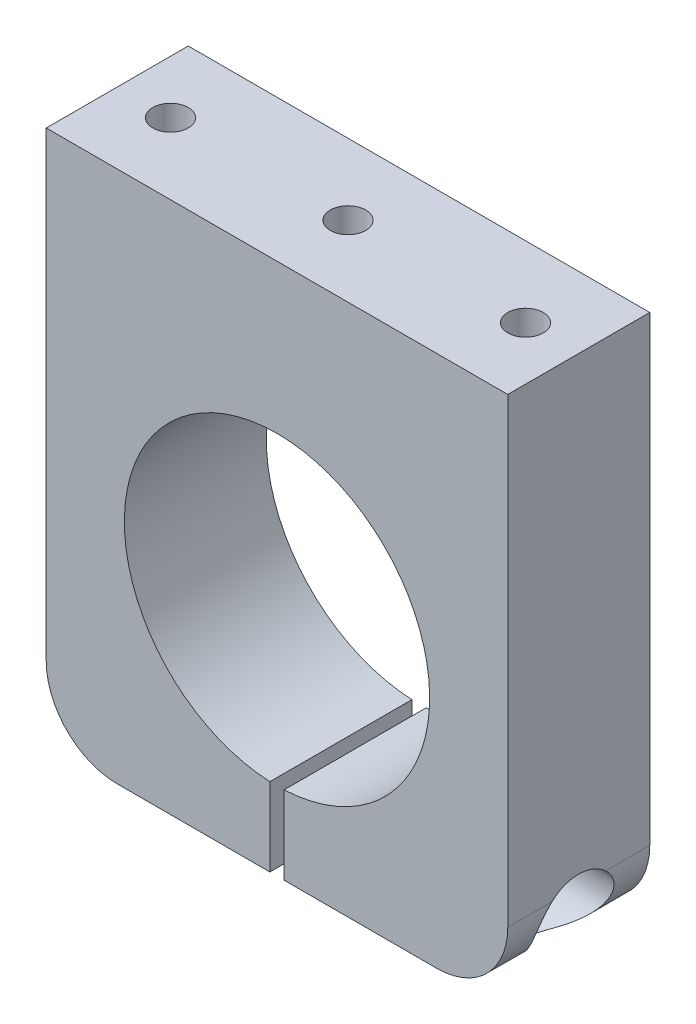
ISO-10303-21;
HEADER;
FILE_DESCRIPTION(('STEP AP214'),'2;1');
FILE_NAME('part.step','',(''),(''),'','','');
FILE_SCHEMA(('AUTOMOTIVE_DESIGN { 1 0 10303 214 1 1 1 1 }'));
ENDSEC;
DATA;
#1=APPLICATION_CONTEXT('core data for automotive mechanical design processes');
#2=APPLICATION_PROTOCOL_DEFINITION('international standard','automotive_design',2000,#1);
#3=PRODUCT_CONTEXT('',#1,'mechanical');
#4=PRODUCT('Part','Part','',(#3));
#5=PRODUCT_RELATED_PRODUCT_CATEGORY('part','',(#4));
#6=PRODUCT_DEFINITION_FORMATION('','',#4);
#7=PRODUCT_DEFINITION_CONTEXT('part definition',#1,'design');
#8=PRODUCT_DEFINITION('design','',#6,#7);
#9=PRODUCT_DEFINITION_SHAPE('','',#8);
#10=(LENGTH_UNIT() NAMED_UNIT(*) SI_UNIT(.MILLI.,.METRE.));
#11=(NAMED_UNIT(*) PLANE_ANGLE_UNIT() SI_UNIT($,.RADIAN.));
#12=(NAMED_UNIT(*) SI_UNIT($,.STERADIAN.) SOLID_ANGLE_UNIT());
#13=UNCERTAINTY_MEASURE_WITH_UNIT(LENGTH_MEASURE(1.E-05),#10,'distance_accuracy_value','');
#14=(GEOMETRIC_REPRESENTATION_CONTEXT(3) GLOBAL_UNCERTAINTY_ASSIGNED_CONTEXT((#13)) GLOBAL_UNIT_ASSIGNED_CONTEXT((#10,
#11,#12)) REPRESENTATION_CONTEXT('',''));
#15=CARTESIAN_POINT('',(0.,0.,0.));
#16=DIRECTION('',(0.,0.,1.));
#17=DIRECTION('',(1.,0.,0.));
#18=AXIS2_PLACEMENT_3D('',#15,#16,#17);
#19=CARTESIAN_POINT('',(22.5,-22.5,20.));
#20=DIRECTION('',(0.,0.,-1.));
#21=DIRECTION('',(-1.,0.,0.));
#22=AXIS2_PLACEMENT_3D('',#19,#20,#21);
#23=CYLINDRICAL_SURFACE('',#22,10.);
#24=CARTESIAN_POINT('',(32.5,-22.5,13.7749172176354));
#25=CARTESIAN_POINT('',(32.5000057537218,-22.5981661418053,13.8789638438867));
#26=CARTESIAN_POINT('',(32.4985549427608,-22.7004281118232,13.9791661374935));
#27=CARTESIAN_POINT('',(32.4920537918978,-22.9124033869391,14.1712781146748));
#28=CARTESIAN_POINT('',(32.4870025332268,-23.0221185874997,14.2631856748384));
#29=CARTESIAN_POINT('',(32.4726139063625,-23.2482008935858,14.4380441297147));
#30=CARTESIAN_POINT('',(32.4632768493705,-23.3645675155999,14.5209956742033));
#31=CARTESIAN_POINT('',(32.4397008531031,-23.6030398081574,14.6773867162477));
#32=CARTESIAN_POINT('',(32.4254624736966,-23.7251448218402,14.7508272989047));
#33=CARTESIAN_POINT('',(32.3915121698096,-23.9743951488146,14.8879030941196));
#34=CARTESIAN_POINT('',(32.3717874023382,-24.1015516810399,14.9515147480937));
#35=CARTESIAN_POINT('',(32.3264594606404,-24.3595277065263,15.0683754546063));
#36=CARTESIAN_POINT('',(32.3008562977103,-24.4903471927481,15.1216245270579));
#37=CARTESIAN_POINT('',(32.2435182407461,-24.7543464267046,15.2175086091483));
#38=CARTESIAN_POINT('',(32.2117897407344,-24.8875235828139,15.2601545816977));
#39=CARTESIAN_POINT('',(32.1420488529151,-25.1551871655067,15.3348650163031));
#40=CARTESIAN_POINT('',(32.1040366256821,-25.2896735585512,15.3669297486898));
#41=CARTESIAN_POINT('',(32.0227799903248,-25.5554011758947,15.4199284122141));
#42=CARTESIAN_POINT('',(31.9796921059961,-25.686638509851,15.4411231869098));
#43=CARTESIAN_POINT('',(31.8876732781683,-25.948308623562,15.4738495878885));
#44=CARTESIAN_POINT('',(31.8387403981601,-26.0787411215303,15.4853780014022));
#45=CARTESIAN_POINT('',(31.7352627947555,-26.3378892043951,15.4991420079286));
#46=CARTESIAN_POINT('',(31.6807165773932,-26.4666043218679,15.501375120448));
#47=CARTESIAN_POINT('',(31.56631678163,-26.7215440403804,15.4970156799925));
#48=CARTESIAN_POINT('',(31.5064612275292,-26.8477676927601,15.4904198286276));
#49=CARTESIAN_POINT('',(31.3774409969961,-27.1057866594331,15.468175464573));
#50=CARTESIAN_POINT('',(31.3079177702017,-27.2373507930785,15.4519237750515));
#51=CARTESIAN_POINT('',(31.1637065793931,-27.4962170326521,15.4106147223492));
#52=CARTESIAN_POINT('',(31.0890165881339,-27.6235174362429,15.3855538868682));
#53=CARTESIAN_POINT('',(30.8579511119642,-27.9982344716421,15.2982095018341));
#54=CARTESIAN_POINT('',(30.6945124766337,-28.2386013414545,15.2237511944236));
#55=CARTESIAN_POINT('',(30.3937621007753,-28.642978867548,15.0688049927341));
#56=CARTESIAN_POINT('',(30.2594928935221,-28.8115448133291,14.9939720969222));
#57=CARTESIAN_POINT('',(29.9839349452677,-29.1359610347216,14.8305984213029));
#58=CARTESIAN_POINT('',(29.8426431252125,-29.2918056521318,14.7420515919886));
#59=CARTESIAN_POINT('',(29.5542224498296,-29.5909268601641,14.5527565536643));
#60=CARTESIAN_POINT('',(29.4070800187313,-29.7341714042708,14.451978700987));
#61=CARTESIAN_POINT('',(29.1086570856751,-30.0077704803518,14.2397541311936));
#62=CARTESIAN_POINT('',(28.957377197665,-30.1381269116578,14.128308990903));
#63=CARTESIAN_POINT('',(28.6483291664972,-30.3891455150794,13.8929244949315));
#64=CARTESIAN_POINT('',(28.490492331258,-30.5095022988474,13.7687505309159));
#65=CARTESIAN_POINT('',(28.1733033322245,-30.7372164693936,13.5107844526122));
#66=CARTESIAN_POINT('',(28.013951069459,-30.8445730007624,13.3769917063358));
#67=CARTESIAN_POINT('',(27.6958698584938,-31.0462450946979,13.1001491527254));
#68=CARTESIAN_POINT('',(27.5371403339061,-31.1405914854494,12.9571224501665));
#69=CARTESIAN_POINT('',(27.2223090437246,-31.3165889261692,12.6608610516785));
#70=CARTESIAN_POINT('',(27.0662058882596,-31.3982468921588,12.5076319822336));
#71=CARTESIAN_POINT('',(26.7843508396736,-31.5368683250075,12.2140470638658));
#72=CARTESIAN_POINT('',(26.6576852071104,-31.5956958546621,12.0754538959878));
#73=CARTESIAN_POINT('',(26.4125005352101,-31.7038151210657,11.7871972431329));
#74=CARTESIAN_POINT('',(26.2939908075635,-31.7530960711177,11.6375214967313));
#75=CARTESIAN_POINT('',(26.0913129574323,-31.833395944011,11.3502755779472));
#76=CARTESIAN_POINT('',(26.0047235031113,-31.8660929599725,11.2149184681059));
#77=CARTESIAN_POINT('',(25.8504917941329,-31.9223615660612,10.9319979209789));
#78=CARTESIAN_POINT('',(25.7827796897687,-31.9459669241939,10.7844821719883));
#79=CARTESIAN_POINT('',(25.6979236211529,-31.9749429646558,10.5334592454044));
#80=CARTESIAN_POINT('',(25.6713417319288,-31.9838258750325,10.4336337396202));
#81=CARTESIAN_POINT('',(25.6344268613252,-31.9960919957075,10.2307484812831));
#82=CARTESIAN_POINT('',(25.6240614660651,-31.9994861774541,10.1276956015662));
#83=CARTESIAN_POINT('',(25.6212641591117,-32.0004061344516,9.92097884453809));
#84=CARTESIAN_POINT('',(25.6288893369536,-31.9979132281669,9.81731406625902));
#85=CARTESIAN_POINT('',(25.6608660156364,-31.9873172822128,9.61285192745603));
#86=CARTESIAN_POINT('',(25.6852466743838,-31.9792044625675,9.51205988501811));
#87=CARTESIAN_POINT('',(25.7616653702247,-31.9532417195032,9.26985537831787));
#88=CARTESIAN_POINT('',(25.8212780131373,-31.9326245362535,9.13119795798267));
#89=CARTESIAN_POINT('',(25.9583429380626,-31.8832395093391,8.86453512061957));
#90=CARTESIAN_POINT('',(26.0358611083321,-31.8544414697413,8.73657148280817));
#91=CARTESIAN_POINT('',(26.2093773375218,-31.787087221149,8.47810877208881));
#92=CARTESIAN_POINT('',(26.3064282743668,-31.7478674022585,8.34850603476597));
#93=CARTESIAN_POINT('',(26.5081074716147,-31.6622665239583,8.09774782470578));
#94=CARTESIAN_POINT('',(26.6127443998128,-31.6158772019253,7.97660233553108));
#95=CARTESIAN_POINT('',(26.8267651672856,-31.5162676911987,7.74091708588718));
#96=CARTESIAN_POINT('',(26.9361610998089,-31.4630293353479,7.62639611244914));
#97=CARTESIAN_POINT('',(27.1574999749032,-31.3500368870487,7.40331905347892));
#98=CARTESIAN_POINT('',(27.2694419711305,-31.2902851852036,7.29476080129411));
#99=CARTESIAN_POINT('',(27.572148445252,-31.1209446712137,7.00997781160998));
#100=CARTESIAN_POINT('',(27.7641486404079,-31.005354084188,6.83859161898463));
#101=CARTESIAN_POINT('',(28.1479513840179,-30.7554953331462,6.50952763787949));
#102=CARTESIAN_POINT('',(28.3397537374938,-30.6212156917218,6.35185837073777));
#103=CARTESIAN_POINT('',(28.7199026037673,-30.3338677959139,6.05099434442149));
#104=CARTESIAN_POINT('',(28.9082547831565,-30.1808342675193,5.90777370195188));
#105=CARTESIAN_POINT('',(29.2792897605019,-29.8554109070895,5.6369762198164));
#106=CARTESIAN_POINT('',(29.4619758725186,-29.6830326730015,5.50939010159263));
#107=CARTESIAN_POINT('',(29.7645431973881,-29.3744292521025,5.30847551009049));
#108=CARTESIAN_POINT('',(29.8865359243162,-29.2432831566936,5.23049123452661));
#109=CARTESIAN_POINT('',(30.1257124828415,-28.9715720363001,5.08419589907064));
#110=CARTESIAN_POINT('',(30.2428976251674,-28.8310096064516,5.01588219000243));
#111=CARTESIAN_POINT('',(30.4713874864724,-28.5407826432395,4.89018732779615));
#112=CARTESIAN_POINT('',(30.5826986156711,-28.3911284321903,4.83279407125507));
#113=CARTESIAN_POINT('',(30.7985329848872,-28.0829837887068,4.73022627549008));
#114=CARTESIAN_POINT('',(30.9030575096518,-27.9244950393264,4.68504941846977));
#115=CARTESIAN_POINT('',(31.0854613901692,-27.6297216908085,4.61556060687982));
#116=CARTESIAN_POINT('',(31.1646749151594,-27.4948072867915,4.58892884502955));
#117=CARTESIAN_POINT('',(31.3172818119621,-27.2201908602356,4.54558536924433));
#118=CARTESIAN_POINT('',(31.3906764746199,-27.0804899094389,4.52887144978915));
#119=CARTESIAN_POINT('',(31.5310597604831,-26.7970869177683,4.50619084334677));
#120=CARTESIAN_POINT('',(31.5980502165951,-26.6533860369828,4.50022107257413));
#121=CARTESIAN_POINT('',(31.725125155465,-26.3629251024784,4.49979102074736));
#122=CARTESIAN_POINT('',(31.7852095773525,-26.216165021809,4.50533084113169));
#123=CARTESIAN_POINT('',(31.8984181720296,-25.9198040903743,4.52865568359381));
#124=CARTESIAN_POINT('',(31.9514935621584,-25.7701908569886,4.54652164013206));
#125=CARTESIAN_POINT('',(32.0499244811205,-25.4704911846271,4.59508067321421));
#126=CARTESIAN_POINT('',(32.0952798770185,-25.320404737548,4.62577397060839));
#127=CARTESIAN_POINT('',(32.1781703426708,-25.0213287478509,4.70025679871255));
#128=CARTESIAN_POINT('',(32.2157058348931,-24.8723391463958,4.74404562162907));
#129=CARTESIAN_POINT('',(32.283078632756,-24.5770882646321,4.84473762467532));
#130=CARTESIAN_POINT('',(32.3129169109322,-24.4308266418145,4.90163914630631));
#131=CARTESIAN_POINT('',(32.3623585308983,-24.158573671311,5.02131215400752));
#132=CARTESIAN_POINT('',(32.3827284399977,-24.0321281495458,5.08274053277824));
#133=CARTESIAN_POINT('',(32.4180513081486,-23.7837414084565,5.21546625356253));
#134=CARTESIAN_POINT('',(32.4330043984211,-23.6618000800838,5.28676335645107));
#135=CARTESIAN_POINT('',(32.4579814428741,-23.423549354579,5.43870653677214));
#136=CARTESIAN_POINT('',(32.4680104744502,-23.3072342680768,5.51934287761998));
#137=CARTESIAN_POINT('',(32.4837494041754,-23.0810300258491,5.68947114091269));
#138=CARTESIAN_POINT('',(32.4894611628571,-22.9711381209082,5.77895922986466));
#139=CARTESIAN_POINT('',(32.4956615404691,-22.8013228980876,5.92851883006367));
#140=CARTESIAN_POINT('',(32.4973270299567,-22.7390840950043,5.98593986520673));
#141=CARTESIAN_POINT('',(32.4994951749132,-22.6174292497584,6.10349051095743));
#142=CARTESIAN_POINT('',(32.5000000629674,-22.558008003741,6.1636146940126));
#143=CARTESIAN_POINT('',(32.5,-22.5,6.22508278236462));
#144=B_SPLINE_CURVE_WITH_KNOTS('',3,(#24,#25,#26,#27,#28,#29,#30,#31,#32,#33,#34,#35,#36,#37,
#38,#39,#40,#41,#42,#43,#44,#45,#46,#47,#48,#49,#50,#51,#52,#53,#54,#55,#56,#57,#58,#59,#60,#61,
#62,#63,#64,#65,#66,#67,#68,#69,#70,#71,#72,#73,#74,#75,#76,#77,#78,#79,#80,#81,#82,#83,#84,#85,
#86,#87,#88,#89,#90,#91,#92,#93,#94,#95,#96,#97,#98,#99,#100,#101,#102,#103,#104,#105,#106,#107,
#108,#109,#110,#111,#112,#113,#114,#115,#116,#117,#118,#119,#120,#121,#122,#123,#124,#125,#126,
#127,#128,#129,#130,#131,#132,#133,#134,#135,#136,#137,#138,#139,#140,#141,#142,#143),
.UNSPECIFIED.,.F.,.F.,(4,2,2,2,2,2,2,2,2,2,2,2,2,2,2,2,2,2,2,2,2,2,2,2,2,2,2,2,2,2,2,2,2,2,2,2,
2,2,2,2,2,2,2,2,2,2,2,2,2,2,2,2,2,2,2,2,2,2,2,4),(0.,0.429045502190893,0.858200528212902,
1.28732439726828,1.71639926457079,2.1464871236895,2.57657415632452,3.00621464043289,
3.43584414718685,3.85461493399112,4.27352485083846,4.69254654853689,5.11172483117969,
5.56033895265007,6.00913010296235,6.90626342487351,7.58982839223342,8.27369575796918,
8.95925497787625,9.64471301530392,10.3465205448469,11.0483742278735,11.7485351552131,
12.448313100124,13.0380903317541,13.6285301157797,14.1194312093572,14.6084910114197,
14.9183396434191,15.2275681483399,15.5377792480829,15.8485315490121,16.3029000551517,
16.7589679476887,17.2579904653032,17.757592438998,18.2585480452267,18.7593204001362,
19.6046712554942,20.4505435713486,21.2948726293875,22.1386981548704,22.7242994951101,
23.309740102707,23.8945280237245,24.4792049159692,24.9548605770462,25.4304104225971,
25.9058237540557,26.3812412755327,26.8598105138972,27.3383879922004,27.8169396087836,
28.2954307311784,28.7210565119575,29.1466719813764,29.5718476549468,29.9968399940469,
30.2508425514293,30.5043560876607),.UNSPECIFIED.);
#145=CARTESIAN_POINT('',(32.5,-22.5,13.7749172176354));
#146=VERTEX_POINT('',#145);
#147=CARTESIAN_POINT('',(32.5,-22.5,6.22508278236462));
#148=VERTEX_POINT('',#147);
#149=EDGE_CURVE('E50',#146,#148,#144,.T.);
#150=ORIENTED_EDGE('',*,*,#149,.F.);
#151=DIRECTION('',(0.,0.,-1.));
#152=VECTOR('',#151,1.);
#153=CARTESIAN_POINT('',(32.5,-22.5,20.));
#154=LINE('',#153,#152);
#155=CARTESIAN_POINT('',(32.5,-22.5,20.));
#156=VERTEX_POINT('',#155);
#157=EDGE_CURVE('E188',#156,#146,#154,.T.);
#158=ORIENTED_EDGE('',*,*,#157,.F.);
#159=CARTESIAN_POINT('',(22.5,-22.5,20.));
#160=DIRECTION('',(0.,0.,1.));
#161=DIRECTION('',(-1.,0.,0.));
#162=AXIS2_PLACEMENT_3D('',#159,#160,#161);
#163=CIRCLE('',#162,10.);
#164=CARTESIAN_POINT('',(22.5,-32.5,20.));
#165=VERTEX_POINT('',#164);
#166=EDGE_CURVE('E298',#165,#156,#163,.T.);
#167=ORIENTED_EDGE('',*,*,#166,.F.);
#168=DIRECTION('',(0.,0.,-1.));
#169=VECTOR('',#168,1.);
#170=CARTESIAN_POINT('',(22.5,-32.5,20.));
#171=LINE('',#170,#169);
#172=CARTESIAN_POINT('',(22.5,-32.5,0.));
#173=VERTEX_POINT('',#172);
#174=EDGE_CURVE('E191',#165,#173,#171,.T.);
#175=ORIENTED_EDGE('',*,*,#174,.T.);
#176=CARTESIAN_POINT('',(22.5,-22.5,0.));
#177=DIRECTION('',(0.,0.,1.));
#178=DIRECTION('',(-1.,0.,0.));
#179=AXIS2_PLACEMENT_3D('',#176,#177,#178);
#180=CIRCLE('',#179,10.);
#181=CARTESIAN_POINT('',(32.5,-22.5,0.));
#182=VERTEX_POINT('',#181);
#183=EDGE_CURVE('E164',#173,#182,#180,.T.);
#184=ORIENTED_EDGE('',*,*,#183,.T.);
#185=EDGE_CURVE('E187',#148,#182,#154,.T.);
#186=ORIENTED_EDGE('',*,*,#185,.F.);
#187=EDGE_LOOP('',(#150,#158,#167,#175,#184,#186));
#188=FACE_BOUND('',#187,.T.);
#189=ADVANCED_FACE('F37',(#188),#23,.T.);
#190=CARTESIAN_POINT('',(40.,-26.5,9.99999999999999));
#191=DIRECTION('',(-1.,0.,0.));
#192=DIRECTION('',(0.,0.,1.));
#193=AXIS2_PLACEMENT_3D('',#190,#191,#192);
#194=CYLINDRICAL_SURFACE('',#193,3.);
#195=CARTESIAN_POINT('',(1.00000000000001,-26.5,9.99999999999999));
#196=DIRECTION('',(1.,0.,0.));
#197=DIRECTION('',(0.,1.,0.));
#198=AXIS2_PLACEMENT_3D('',#195,#196,#197);
#199=CIRCLE('',#198,3.);
#200=CARTESIAN_POINT('',(1.00000000000001,-23.5,9.99999999999999));
#201=VERTEX_POINT('',#200);
#202=EDGE_CURVE('E202',#201,#201,#199,.F.);
#203=ORIENTED_EDGE('',*,*,#202,.T.);
#204=EDGE_LOOP('',(#203));
#205=FACE_BOUND('',#204,.T.);
#206=CARTESIAN_POINT('',(20.,-26.5,9.99999999999999));
#207=DIRECTION('',(1.,0.,0.));
#208=DIRECTION('',(0.,0.,-1.));
#209=AXIS2_PLACEMENT_3D('',#206,#207,#208);
#210=CIRCLE('',#209,3.);
#211=CARTESIAN_POINT('',(20.,-26.5,6.99999999999999));
#212=VERTEX_POINT('',#211);
#213=EDGE_CURVE('E197',#212,#212,#210,.T.);
#214=ORIENTED_EDGE('',*,*,#213,.T.);
#215=EDGE_LOOP('',(#214));
#216=FACE_BOUND('',#215,.T.);
#217=ADVANCED_FACE('F227',(#205,#216),#194,.F.);
#218=CARTESIAN_POINT('',(0.,0.,20.));
#219=DIRECTION('',(0.,0.,-1.));
#220=DIRECTION('',(-1.,0.,0.));
#221=AXIS2_PLACEMENT_3D('',#218,#219,#220);
#222=CYLINDRICAL_SURFACE('',#221,21.5);
#223=CARTESIAN_POINT('',(0.,0.,0.));
#224=DIRECTION('',(0.,0.,-1.));
#225=DIRECTION('',(1.,0.,0.));
#226=AXIS2_PLACEMENT_3D('',#223,#224,#225);
#227=CIRCLE('',#226,21.5);
#228=CARTESIAN_POINT('',(-0.999999999999991,-21.4767315949145,0.));
#229=VERTEX_POINT('',#228);
#230=CARTESIAN_POINT('',(1.00000000000001,-21.4767315949145,0.));
#231=VERTEX_POINT('',#230);
#232=EDGE_CURVE('E156',#229,#231,#227,.T.);
#233=ORIENTED_EDGE('',*,*,#232,.T.);
#234=DIRECTION('',(0.,0.,-1.));
#235=VECTOR('',#234,1.);
#236=CARTESIAN_POINT('',(1.00000000000001,-21.4767315949145,20.));
#237=LINE('',#236,#235);
#238=CARTESIAN_POINT('',(1.00000000000001,-21.4767315949145,20.));
#239=VERTEX_POINT('',#238);
#240=EDGE_CURVE('E45',#239,#231,#237,.T.);
#241=ORIENTED_EDGE('',*,*,#240,.F.);
#242=CARTESIAN_POINT('',(0.,0.,20.));
#243=DIRECTION('',(0.,0.,-1.));
#244=DIRECTION('',(1.,0.,0.));
#245=AXIS2_PLACEMENT_3D('',#242,#243,#244);
#246=CIRCLE('',#245,21.5);
#247=CARTESIAN_POINT('',(-0.999999999999991,-21.4767315949145,20.));
#248=VERTEX_POINT('',#247);
#249=EDGE_CURVE('E177',#248,#239,#246,.T.);
#250=ORIENTED_EDGE('',*,*,#249,.F.);
#251=DIRECTION('',(0.,0.,-1.));
#252=VECTOR('',#251,1.);
#253=CARTESIAN_POINT('',(-0.999999999999991,-21.4767315949145,20.));
#254=LINE('',#253,#252);
#255=EDGE_CURVE('E152',#248,#229,#254,.T.);
#256=ORIENTED_EDGE('',*,*,#255,.T.);
#257=EDGE_LOOP('',(#233,#241,#250,#256));
#258=FACE_BOUND('',#257,.T.);
#259=ADVANCED_FACE('F39',(#258),#222,.F.);
#260=CARTESIAN_POINT('',(1.00000000000001,-21.4767315949145,20.));
#261=DIRECTION('',(1.,0.,0.));
#262=DIRECTION('',(0.,1.,0.));
#263=AXIS2_PLACEMENT_3D('',#260,#261,#262);
#264=PLANE('',#263);
#265=ORIENTED_EDGE('',*,*,#202,.F.);
#266=EDGE_LOOP('',(#265));
#267=FACE_BOUND('',#266,.T.);
#268=DIRECTION('',(0.,-1.,0.));
#269=VECTOR('',#268,1.);
#270=CARTESIAN_POINT('',(1.00000000000001,-21.4767315949145,0.));
#271=LINE('',#270,#269);
#272=CARTESIAN_POINT('',(1.00000000000001,-32.5,0.));
#273=VERTEX_POINT('',#272);
#274=EDGE_CURVE('E159',#231,#273,#271,.T.);
#275=ORIENTED_EDGE('',*,*,#274,.T.);
#276=DIRECTION('',(0.,0.,-1.));
#277=VECTOR('',#276,1.);
#278=CARTESIAN_POINT('',(1.00000000000001,-32.5,20.));
#279=LINE('',#278,#277);
#280=CARTESIAN_POINT('',(1.00000000000001,-32.5,20.));
#281=VERTEX_POINT('',#280);
#282=EDGE_CURVE('E194',#281,#273,#279,.T.);
#283=ORIENTED_EDGE('',*,*,#282,.F.);
#284=DIRECTION('',(0.,-1.,0.));
#285=VECTOR('',#284,1.);
#286=CARTESIAN_POINT('',(1.00000000000001,-21.4767315949145,20.));
#287=LINE('',#286,#285);
#288=EDGE_CURVE('E107',#239,#281,#287,.T.);
#289=ORIENTED_EDGE('',*,*,#288,.F.);
#290=ORIENTED_EDGE('',*,*,#240,.T.);
#291=EDGE_LOOP('',(#275,#283,#289,#290));
#292=FACE_BOUND('',#291,.T.);
#293=ADVANCED_FACE('F281',(#267,#292),#264,.F.);
#294=CARTESIAN_POINT('',(22.5,-32.5,20.));
#295=DIRECTION('',(0.,1.,0.));
#296=DIRECTION('',(0.,0.,1.));
#297=AXIS2_PLACEMENT_3D('',#294,#295,#296);
#298=PLANE('',#297);
#299=DIRECTION('',(1.,0.,0.));
#300=VECTOR('',#299,1.);
#301=CARTESIAN_POINT('',(22.5,-32.5,0.));
#302=LINE('',#301,#300);
#303=EDGE_CURVE('E162',#273,#173,#302,.T.);
#304=ORIENTED_EDGE('',*,*,#303,.T.);
#305=ORIENTED_EDGE('',*,*,#174,.F.);
#306=DIRECTION('',(1.,0.,0.));
#307=VECTOR('',#306,1.);
#308=CARTESIAN_POINT('',(22.5,-32.5,20.));
#309=LINE('',#308,#307);
#310=EDGE_CURVE('E301',#281,#165,#309,.T.);
#311=ORIENTED_EDGE('',*,*,#310,.F.);
#312=ORIENTED_EDGE('',*,*,#282,.T.);
#313=EDGE_LOOP('',(#304,#305,#311,#312));
#314=FACE_BOUND('',#313,.T.);
#315=ADVANCED_FACE('F276',(#314),#298,.F.);
#316=CARTESIAN_POINT('',(32.5,42.5,20.));
#317=DIRECTION('',(-1.,0.,0.));
#318=DIRECTION('',(0.,-1.,0.));
#319=AXIS2_PLACEMENT_3D('',#316,#317,#318);
#320=PLANE('',#319);
#321=CARTESIAN_POINT('',(32.5,-26.5,9.99999999999999));
#322=DIRECTION('',(-1.,0.,0.));
#323=DIRECTION('',(0.,-1.,0.));
#324=AXIS2_PLACEMENT_3D('',#321,#322,#323);
#325=CIRCLE('',#324,5.5);
#326=EDGE_CURVE('E11',#148,#146,#325,.F.);
#327=ORIENTED_EDGE('',*,*,#326,.F.);
#328=ORIENTED_EDGE('',*,*,#185,.T.);
#329=DIRECTION('',(0.,1.,0.));
#330=VECTOR('',#329,1.);
#331=CARTESIAN_POINT('',(32.5,42.5,0.));
#332=LINE('',#331,#330);
#333=CARTESIAN_POINT('',(32.5,42.5,0.));
#334=VERTEX_POINT('',#333);
#335=EDGE_CURVE('E167',#182,#334,#332,.T.);
#336=ORIENTED_EDGE('',*,*,#335,.T.);
#337=DIRECTION('',(0.,0.,-1.));
#338=VECTOR('',#337,1.);
#339=CARTESIAN_POINT('',(32.5,42.5,20.));
#340=LINE('',#339,#338);
#341=CARTESIAN_POINT('',(32.5,42.5,20.));
#342=VERTEX_POINT('',#341);
#343=EDGE_CURVE('E184',#342,#334,#340,.T.);
#344=ORIENTED_EDGE('',*,*,#343,.F.);
#345=DIRECTION('',(0.,1.,0.));
#346=VECTOR('',#345,1.);
#347=CARTESIAN_POINT('',(32.5,42.5,20.));
#348=LINE('',#347,#346);
#349=EDGE_CURVE('E295',#156,#342,#348,.T.);
#350=ORIENTED_EDGE('',*,*,#349,.F.);
#351=ORIENTED_EDGE('',*,*,#157,.T.);
#352=EDGE_LOOP('',(#327,#328,#336,#344,#350,#351));
#353=FACE_BOUND('',#352,.T.);
#354=ADVANCED_FACE('F273',(#353),#320,.F.);
#355=CARTESIAN_POINT('',(-32.5,42.5,20.));
#356=DIRECTION('',(0.,-1.,0.));
#357=DIRECTION('',(1.,0.,0.));
#358=AXIS2_PLACEMENT_3D('',#355,#356,#357);
#359=PLANE('',#358);
#360=CARTESIAN_POINT('',(0.,42.5,10.));
#361=DIRECTION('',(0.,1.,0.));
#362=DIRECTION('',(0.,0.,1.));
#363=AXIS2_PLACEMENT_3D('',#360,#361,#362);
#364=CIRCLE('',#363,2.5);
#365=CARTESIAN_POINT('',(0.,42.5,12.5));
#366=VERTEX_POINT('',#365);
#367=EDGE_CURVE('E320',#366,#366,#364,.T.);
#368=ORIENTED_EDGE('',*,*,#367,.F.);
#369=EDGE_LOOP('',(#368));
#370=FACE_BOUND('',#369,.T.);
#371=CARTESIAN_POINT('',(25.,42.5,10.));
#372=DIRECTION('',(0.,1.,0.));
#373=DIRECTION('',(0.,0.,1.));
#374=AXIS2_PLACEMENT_3D('',#371,#372,#373);
#375=CIRCLE('',#374,2.5);
#376=CARTESIAN_POINT('',(25.,42.5,12.5));
#377=VERTEX_POINT('',#376);
#378=EDGE_CURVE('E315',#377,#377,#375,.T.);
#379=ORIENTED_EDGE('',*,*,#378,.F.);
#380=EDGE_LOOP('',(#379));
#381=FACE_BOUND('',#380,.T.);
#382=CARTESIAN_POINT('',(-25.,42.5,10.));
#383=DIRECTION('',(0.,1.,0.));
#384=DIRECTION('',(0.,0.,1.));
#385=AXIS2_PLACEMENT_3D('',#382,#383,#384);
#386=CIRCLE('',#385,2.5);
#387=CARTESIAN_POINT('',(-25.,42.5,12.5));
#388=VERTEX_POINT('',#387);
#389=EDGE_CURVE('E309',#388,#388,#386,.T.);
#390=ORIENTED_EDGE('',*,*,#389,.F.);
#391=EDGE_LOOP('',(#390));
#392=FACE_BOUND('',#391,.T.);
#393=DIRECTION('',(-1.,0.,0.));
#394=VECTOR('',#393,1.);
#395=CARTESIAN_POINT('',(-32.5,42.5,0.));
#396=LINE('',#395,#394);
#397=CARTESIAN_POINT('',(-32.5,42.5,0.));
#398=VERTEX_POINT('',#397);
#399=EDGE_CURVE('E169',#334,#398,#396,.T.);
#400=ORIENTED_EDGE('',*,*,#399,.T.);
#401=DIRECTION('',(0.,0.,-1.));
#402=VECTOR('',#401,1.);
#403=CARTESIAN_POINT('',(-32.5,42.5,20.));
#404=LINE('',#403,#402);
#405=CARTESIAN_POINT('',(-32.5,42.5,20.));
#406=VERTEX_POINT('',#405);
#407=EDGE_CURVE('E181',#406,#398,#404,.T.);
#408=ORIENTED_EDGE('',*,*,#407,.F.);
#409=DIRECTION('',(-1.,0.,0.));
#410=VECTOR('',#409,1.);
#411=CARTESIAN_POINT('',(-32.5,42.5,20.));
#412=LINE('',#411,#410);
#413=EDGE_CURVE('E297',#342,#406,#412,.T.);
#414=ORIENTED_EDGE('',*,*,#413,.F.);
#415=ORIENTED_EDGE('',*,*,#343,.T.);
#416=EDGE_LOOP('',(#400,#408,#414,#415));
#417=FACE_BOUND('',#416,.T.);
#418=ADVANCED_FACE('F270',(#370,#381,#392,#417),#359,.F.);
#419=CARTESIAN_POINT('',(-32.5,42.5,20.));
#420=DIRECTION('',(1.,0.,0.));
#421=DIRECTION('',(0.,1.,0.));
#422=AXIS2_PLACEMENT_3D('',#419,#420,#421);
#423=PLANE('',#422);
#424=DIRECTION('',(0.,-1.,0.));
#425=VECTOR('',#424,1.);
#426=CARTESIAN_POINT('',(-32.5,42.5,0.));
#427=LINE('',#426,#425);
#428=CARTESIAN_POINT('',(-32.5,-22.5,0.));
#429=VERTEX_POINT('',#428);
#430=EDGE_CURVE('E171',#398,#429,#427,.T.);
#431=ORIENTED_EDGE('',*,*,#430,.T.);
#432=DIRECTION('',(0.,0.,-1.));
#433=VECTOR('',#432,1.);
#434=CARTESIAN_POINT('',(-32.5,-22.5,20.));
#435=LINE('',#434,#433);
#436=CARTESIAN_POINT('',(-32.5,-22.5,20.));
#437=VERTEX_POINT('',#436);
#438=EDGE_CURVE('E147',#437,#429,#435,.T.);
#439=ORIENTED_EDGE('',*,*,#438,.F.);
#440=DIRECTION('',(0.,-1.,0.));
#441=VECTOR('',#440,1.);
#442=CARTESIAN_POINT('',(-32.5,42.5,20.));
#443=LINE('',#442,#441);
#444=EDGE_CURVE('E135',#406,#437,#443,.T.);
#445=ORIENTED_EDGE('',*,*,#444,.F.);
#446=ORIENTED_EDGE('',*,*,#407,.T.);
#447=EDGE_LOOP('',(#431,#439,#445,#446));
#448=FACE_BOUND('',#447,.T.);
#449=ADVANCED_FACE('F267',(#448),#423,.F.);
#450=CARTESIAN_POINT('',(-22.5,-22.5,20.));
#451=DIRECTION('',(0.,0.,-1.));
#452=DIRECTION('',(-1.,0.,0.));
#453=AXIS2_PLACEMENT_3D('',#450,#451,#452);
#454=CYLINDRICAL_SURFACE('',#453,10.);
#455=CARTESIAN_POINT('',(-22.5,-22.5,0.));
#456=DIRECTION('',(0.,0.,1.));
#457=DIRECTION('',(1.,0.,0.));
#458=AXIS2_PLACEMENT_3D('',#455,#456,#457);
#459=CIRCLE('',#458,10.);
#460=CARTESIAN_POINT('',(-22.5,-32.5,0.));
#461=VERTEX_POINT('',#460);
#462=EDGE_CURVE('E144',#429,#461,#459,.T.);
#463=ORIENTED_EDGE('',*,*,#462,.T.);
#464=DIRECTION('',(0.,0.,-1.));
#465=VECTOR('',#464,1.);
#466=CARTESIAN_POINT('',(-22.5,-32.5,20.));
#467=LINE('',#466,#465);
#468=CARTESIAN_POINT('',(-22.5,-32.5,20.));
#469=VERTEX_POINT('',#468);
#470=EDGE_CURVE('E141',#469,#461,#467,.T.);
#471=ORIENTED_EDGE('',*,*,#470,.F.);
#472=CARTESIAN_POINT('',(-22.5,-22.5,20.));
#473=DIRECTION('',(0.,0.,1.));
#474=DIRECTION('',(1.,0.,0.));
#475=AXIS2_PLACEMENT_3D('',#472,#473,#474);
#476=CIRCLE('',#475,10.);
#477=EDGE_CURVE('E128',#437,#469,#476,.T.);
#478=ORIENTED_EDGE('',*,*,#477,.F.);
#479=ORIENTED_EDGE('',*,*,#438,.T.);
#480=EDGE_LOOP('',(#463,#471,#478,#479));
#481=FACE_BOUND('',#480,.T.);
#482=ADVANCED_FACE('F142',(#481),#454,.T.);
#483=CARTESIAN_POINT('',(-22.5,-32.5,20.));
#484=DIRECTION('',(0.,1.,0.));
#485=DIRECTION('',(-1.,0.,0.));
#486=AXIS2_PLACEMENT_3D('',#483,#484,#485);
#487=PLANE('',#486);
#488=DIRECTION('',(1.,0.,0.));
#489=VECTOR('',#488,1.);
#490=CARTESIAN_POINT('',(-22.5,-32.5,0.));
#491=LINE('',#490,#489);
#492=CARTESIAN_POINT('',(-0.999999999999987,-32.5,0.));
#493=VERTEX_POINT('',#492);
#494=EDGE_CURVE('E174',#461,#493,#491,.T.);
#495=ORIENTED_EDGE('',*,*,#494,.T.);
#496=DIRECTION('',(0.,0.,-1.));
#497=VECTOR('',#496,1.);
#498=CARTESIAN_POINT('',(-0.999999999999987,-32.5,20.));
#499=LINE('',#498,#497);
#500=CARTESIAN_POINT('',(-0.999999999999987,-32.5,20.));
#501=VERTEX_POINT('',#500);
#502=EDGE_CURVE('E148',#501,#493,#499,.T.);
#503=ORIENTED_EDGE('',*,*,#502,.F.);
#504=DIRECTION('',(1.,0.,0.));
#505=VECTOR('',#504,1.);
#506=CARTESIAN_POINT('',(-22.5,-32.5,20.));
#507=LINE('',#506,#505);
#508=EDGE_CURVE('E132',#469,#501,#507,.T.);
#509=ORIENTED_EDGE('',*,*,#508,.F.);
#510=ORIENTED_EDGE('',*,*,#470,.T.);
#511=EDGE_LOOP('',(#495,#503,#509,#510));
#512=FACE_BOUND('',#511,.T.);
#513=ADVANCED_FACE('F150',(#512),#487,.F.);
#514=CARTESIAN_POINT('',(-0.999999999999991,-21.4767315949145,20.));
#515=DIRECTION('',(-1.,0.,0.));
#516=DIRECTION('',(0.,-1.,0.));
#517=AXIS2_PLACEMENT_3D('',#514,#515,#516);
#518=PLANE('',#517);
#519=DIRECTION('',(0.,1.,0.));
#520=VECTOR('',#519,1.);
#521=CARTESIAN_POINT('',(-0.999999999999991,-21.4767315949145,0.));
#522=LINE('',#521,#520);
#523=EDGE_CURVE('E98',#493,#229,#522,.T.);
#524=ORIENTED_EDGE('',*,*,#523,.T.);
#525=ORIENTED_EDGE('',*,*,#255,.F.);
#526=DIRECTION('',(0.,1.,0.));
#527=VECTOR('',#526,1.);
#528=CARTESIAN_POINT('',(-0.999999999999991,-21.4767315949145,20.));
#529=LINE('',#528,#527);
#530=EDGE_CURVE('E59',#501,#248,#529,.T.);
#531=ORIENTED_EDGE('',*,*,#530,.F.);
#532=ORIENTED_EDGE('',*,*,#502,.T.);
#533=EDGE_LOOP('',(#524,#525,#531,#532));
#534=FACE_BOUND('',#533,.T.);
#535=ADVANCED_FACE('F257',(#534),#518,.F.);
#536=CARTESIAN_POINT('',(0.,0.,20.));
#537=DIRECTION('',(0.,0.,1.));
#538=DIRECTION('',(1.,0.,0.));
#539=AXIS2_PLACEMENT_3D('',#536,#537,#538);
#540=PLANE('',#539);
#541=ORIENTED_EDGE('',*,*,#249,.T.);
#542=ORIENTED_EDGE('',*,*,#288,.T.);
#543=ORIENTED_EDGE('',*,*,#310,.T.);
#544=ORIENTED_EDGE('',*,*,#166,.T.);
#545=ORIENTED_EDGE('',*,*,#349,.T.);
#546=ORIENTED_EDGE('',*,*,#413,.T.);
#547=ORIENTED_EDGE('',*,*,#444,.T.);
#548=ORIENTED_EDGE('',*,*,#477,.T.);
#549=ORIENTED_EDGE('',*,*,#508,.T.);
#550=ORIENTED_EDGE('',*,*,#530,.T.);
#551=EDGE_LOOP('',(#541,#542,#543,#544,#545,#546,#547,#548,#549,#550));
#552=FACE_BOUND('',#551,.T.);
#553=ADVANCED_FACE('F130',(#552),#540,.T.);
#554=CARTESIAN_POINT('',(0.,0.,0.));
#555=DIRECTION('',(0.,0.,1.));
#556=DIRECTION('',(1.,0.,0.));
#557=AXIS2_PLACEMENT_3D('',#554,#555,#556);
#558=PLANE('',#557);
#559=ORIENTED_EDGE('',*,*,#232,.F.);
#560=ORIENTED_EDGE('',*,*,#523,.F.);
#561=ORIENTED_EDGE('',*,*,#494,.F.);
#562=ORIENTED_EDGE('',*,*,#462,.F.);
#563=ORIENTED_EDGE('',*,*,#430,.F.);
#564=ORIENTED_EDGE('',*,*,#399,.F.);
#565=ORIENTED_EDGE('',*,*,#335,.F.);
#566=ORIENTED_EDGE('',*,*,#183,.F.);
#567=ORIENTED_EDGE('',*,*,#303,.F.);
#568=ORIENTED_EDGE('',*,*,#274,.F.);
#569=EDGE_LOOP('',(#559,#560,#561,#562,#563,#564,#565,#566,#567,#568));
#570=FACE_BOUND('',#569,.T.);
#571=ADVANCED_FACE('F253',(#570),#558,.F.);
#572=CARTESIAN_POINT('',(-25.,25.5,10.));
#573=DIRECTION('',(0.,1.,0.));
#574=DIRECTION('',(0.,0.,1.));
#575=AXIS2_PLACEMENT_3D('',#572,#573,#574);
#576=CONICAL_SURFACE('',#575,2.5,1.02974425867665);
#577=CARTESIAN_POINT('',(-25.,23.9978484524311,10.));
#578=VERTEX_POINT('',#577);
#579=VERTEX_LOOP('',#578);
#580=FACE_BOUND('',#579,.T.);
#581=CARTESIAN_POINT('',(-25.,25.5,10.));
#582=DIRECTION('',(0.,1.,0.));
#583=DIRECTION('',(0.,0.,1.));
#584=AXIS2_PLACEMENT_3D('',#581,#582,#583);
#585=CIRCLE('',#584,2.5);
#586=CARTESIAN_POINT('',(-25.,25.5,12.5));
#587=VERTEX_POINT('',#586);
#588=EDGE_CURVE('E160',#587,#587,#585,.T.);
#589=ORIENTED_EDGE('',*,*,#588,.T.);
#590=EDGE_LOOP('',(#589));
#591=FACE_BOUND('',#590,.T.);
#592=ADVANCED_FACE('F249',(#580,#591),#576,.F.);
#593=CARTESIAN_POINT('',(-25.,42.5,10.));
#594=DIRECTION('',(0.,1.,0.));
#595=DIRECTION('',(0.,0.,1.));
#596=AXIS2_PLACEMENT_3D('',#593,#594,#595);
#597=CYLINDRICAL_SURFACE('',#596,2.5);
#598=ORIENTED_EDGE('',*,*,#588,.F.);
#599=EDGE_LOOP('',(#598));
#600=FACE_BOUND('',#599,.T.);
#601=ORIENTED_EDGE('',*,*,#389,.T.);
#602=EDGE_LOOP('',(#601));
#603=FACE_BOUND('',#602,.T.);
#604=ADVANCED_FACE('F245',(#600,#603),#597,.F.);
#605=CARTESIAN_POINT('',(25.,25.5,10.));
#606=DIRECTION('',(0.,1.,0.));
#607=DIRECTION('',(0.,0.,1.));
#608=AXIS2_PLACEMENT_3D('',#605,#606,#607);
#609=CONICAL_SURFACE('',#608,2.5,1.02974425867665);
#610=CARTESIAN_POINT('',(25.,23.9978484524311,10.));
#611=VERTEX_POINT('',#610);
#612=VERTEX_LOOP('',#611);
#613=FACE_BOUND('',#612,.T.);
#614=CARTESIAN_POINT('',(25.,25.5,10.));
#615=DIRECTION('',(0.,1.,0.));
#616=DIRECTION('',(0.,0.,1.));
#617=AXIS2_PLACEMENT_3D('',#614,#615,#616);
#618=CIRCLE('',#617,2.5);
#619=CARTESIAN_POINT('',(25.,25.5,12.5));
#620=VERTEX_POINT('',#619);
#621=EDGE_CURVE('E312',#620,#620,#618,.T.);
#622=ORIENTED_EDGE('',*,*,#621,.T.);
#623=EDGE_LOOP('',(#622));
#624=FACE_BOUND('',#623,.T.);
#625=ADVANCED_FACE('F241',(#613,#624),#609,.F.);
#626=CARTESIAN_POINT('',(25.,42.5,10.));
#627=DIRECTION('',(0.,1.,0.));
#628=DIRECTION('',(0.,0.,1.));
#629=AXIS2_PLACEMENT_3D('',#626,#627,#628);
#630=CYLINDRICAL_SURFACE('',#629,2.5);
#631=ORIENTED_EDGE('',*,*,#621,.F.);
#632=EDGE_LOOP('',(#631));
#633=FACE_BOUND('',#632,.T.);
#634=ORIENTED_EDGE('',*,*,#378,.T.);
#635=EDGE_LOOP('',(#634));
#636=FACE_BOUND('',#635,.T.);
#637=ADVANCED_FACE('F237',(#633,#636),#630,.F.);
#638=CARTESIAN_POINT('',(0.,25.5,10.));
#639=DIRECTION('',(0.,1.,0.));
#640=DIRECTION('',(0.,0.,1.));
#641=AXIS2_PLACEMENT_3D('',#638,#639,#640);
#642=CONICAL_SURFACE('',#641,2.5,1.02974425867665);
#643=CARTESIAN_POINT('',(0.,23.9978484524311,10.));
#644=VERTEX_POINT('',#643);
#645=VERTEX_LOOP('',#644);
#646=FACE_BOUND('',#645,.T.);
#647=CARTESIAN_POINT('',(0.,25.5,10.));
#648=DIRECTION('',(0.,1.,0.));
#649=DIRECTION('',(0.,0.,1.));
#650=AXIS2_PLACEMENT_3D('',#647,#648,#649);
#651=CIRCLE('',#650,2.5);
#652=CARTESIAN_POINT('',(0.,25.5,12.5));
#653=VERTEX_POINT('',#652);
#654=EDGE_CURVE('E318',#653,#653,#651,.T.);
#655=ORIENTED_EDGE('',*,*,#654,.T.);
#656=EDGE_LOOP('',(#655));
#657=FACE_BOUND('',#656,.T.);
#658=ADVANCED_FACE('F233',(#646,#657),#642,.F.);
#659=CARTESIAN_POINT('',(0.,42.5,10.));
#660=DIRECTION('',(0.,1.,0.));
#661=DIRECTION('',(0.,0.,1.));
#662=AXIS2_PLACEMENT_3D('',#659,#660,#661);
#663=CYLINDRICAL_SURFACE('',#662,2.5);
#664=ORIENTED_EDGE('',*,*,#654,.F.);
#665=EDGE_LOOP('',(#664));
#666=FACE_BOUND('',#665,.T.);
#667=ORIENTED_EDGE('',*,*,#367,.T.);
#668=EDGE_LOOP('',(#667));
#669=FACE_BOUND('',#668,.T.);
#670=ADVANCED_FACE('F225',(#666,#669),#663,.F.);
#671=CARTESIAN_POINT('',(40.,-26.5,9.99999999999999));
#672=DIRECTION('',(-1.,0.,0.));
#673=DIRECTION('',(0.,0.,1.));
#674=AXIS2_PLACEMENT_3D('',#671,#672,#673);
#675=CYLINDRICAL_SURFACE('',#674,5.5);
#676=CARTESIAN_POINT('',(20.,-26.5,9.99999999999999));
#677=DIRECTION('',(1.,0.,0.));
#678=DIRECTION('',(0.,0.,-1.));
#679=AXIS2_PLACEMENT_3D('',#676,#677,#678);
#680=CIRCLE('',#679,5.5);
#681=CARTESIAN_POINT('',(20.,-26.5,4.49999999999999));
#682=VERTEX_POINT('',#681);
#683=EDGE_CURVE('E199',#682,#682,#680,.T.);
#684=ORIENTED_EDGE('',*,*,#683,.F.);
#685=EDGE_LOOP('',(#684));
#686=FACE_BOUND('',#685,.T.);
#687=ORIENTED_EDGE('',*,*,#149,.T.);
#688=ORIENTED_EDGE('',*,*,#326,.T.);
#689=EDGE_LOOP('',(#687,#688));
#690=FACE_BOUND('',#689,.T.);
#691=ADVANCED_FACE('F219',(#686,#690),#675,.F.);
#692=CARTESIAN_POINT('',(20.,-26.5,9.99999999999999));
#693=DIRECTION('',(1.,0.,0.));
#694=DIRECTION('',(0.,0.,-1.));
#695=AXIS2_PLACEMENT_3D('',#692,#693,#694);
#696=PLANE('',#695);
#697=ORIENTED_EDGE('',*,*,#213,.F.);
#698=EDGE_LOOP('',(#697));
#699=FACE_BOUND('',#698,.T.);
#700=ORIENTED_EDGE('',*,*,#683,.T.);
#701=EDGE_LOOP('',(#700));
#702=FACE_BOUND('',#701,.T.);
#703=ADVANCED_FACE('F224',(#699,#702),#696,.T.);
#704=CLOSED_SHELL('',(#189,#217,#259,#293,#315,#354,#418,#449,#482,#513,#535,#553,#571,#592,
#604,#625,#637,#658,#670,#691,#703));
#705=MANIFOLD_SOLID_BREP('B2',#704);
#706=ADVANCED_BREP_SHAPE_REPRESENTATION('',(#18,#705),#14);
#707=SHAPE_DEFINITION_REPRESENTATION(#9,#706);
ENDSEC;
END-ISO-10303-21;
